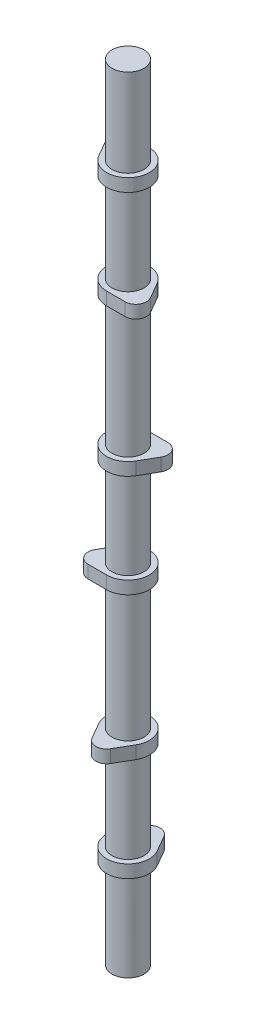
ISO-10303-21;
HEADER;
FILE_DESCRIPTION(('STEP AP214'),'2;1');
FILE_NAME('part.step','',(''),(''),'','','');
FILE_SCHEMA(('AUTOMOTIVE_DESIGN { 1 0 10303 214 1 1 1 1 }'));
ENDSEC;
DATA;
#1=APPLICATION_CONTEXT('core data for automotive mechanical design processes');
#2=APPLICATION_PROTOCOL_DEFINITION('international standard','automotive_design',2000,#1);
#3=PRODUCT_CONTEXT('',#1,'mechanical');
#4=PRODUCT('Part','Part','',(#3));
#5=PRODUCT_RELATED_PRODUCT_CATEGORY('part','',(#4));
#6=PRODUCT_DEFINITION_FORMATION('','',#4);
#7=PRODUCT_DEFINITION_CONTEXT('part definition',#1,'design');
#8=PRODUCT_DEFINITION('design','',#6,#7);
#9=PRODUCT_DEFINITION_SHAPE('','',#8);
#10=(LENGTH_UNIT() NAMED_UNIT(*) SI_UNIT(.MILLI.,.METRE.));
#11=(NAMED_UNIT(*) PLANE_ANGLE_UNIT() SI_UNIT($,.RADIAN.));
#12=(NAMED_UNIT(*) SI_UNIT($,.STERADIAN.) SOLID_ANGLE_UNIT());
#13=UNCERTAINTY_MEASURE_WITH_UNIT(LENGTH_MEASURE(1.E-05),#10,'distance_accuracy_value','');
#14=(GEOMETRIC_REPRESENTATION_CONTEXT(3) GLOBAL_UNCERTAINTY_ASSIGNED_CONTEXT((#13)) GLOBAL_UNIT_ASSIGNED_CONTEXT((#10,
#11,#12)) REPRESENTATION_CONTEXT('',''));
#15=CARTESIAN_POINT('',(0.,0.,0.));
#16=DIRECTION('',(0.,0.,1.));
#17=DIRECTION('',(1.,0.,0.));
#18=AXIS2_PLACEMENT_3D('',#15,#16,#17);
#19=CARTESIAN_POINT('',(0.,412.66,0.));
#20=DIRECTION('',(0.,-1.,0.));
#21=DIRECTION('',(0.866025403784436,0.,0.500000000000004));
#22=AXIS2_PLACEMENT_3D('',#19,#20,#21);
#23=CYLINDRICAL_SURFACE('',#22,9.5);
#24=CARTESIAN_POINT('',(0.,299.66,0.));
#25=DIRECTION('',(0.,1.,0.));
#26=DIRECTION('',(-0.866025403784436,0.,-0.500000000000004));
#27=AXIS2_PLACEMENT_3D('',#24,#25,#26);
#28=CIRCLE('',#27,9.5);
#29=CARTESIAN_POINT('',(-8.22724133595215,299.66,-4.75000000000004));
#30=VERTEX_POINT('',#29);
#31=EDGE_CURVE('E386',#30,#30,#28,.F.);
#32=ORIENTED_EDGE('',*,*,#31,.F.);
#33=EDGE_LOOP('',(#32));
#34=FACE_BOUND('',#33,.T.);
#35=CARTESIAN_POINT('',(0.,353.,0.));
#36=DIRECTION('',(0.,1.,0.));
#37=DIRECTION('',(-0.866025403784436,0.,-0.500000000000004));
#38=AXIS2_PLACEMENT_3D('',#35,#36,#37);
#39=CIRCLE('',#38,9.5);
#40=CARTESIAN_POINT('',(-8.22724133595215,353.,-4.75000000000004));
#41=VERTEX_POINT('',#40);
#42=EDGE_CURVE('E11',#41,#41,#39,.T.);
#43=ORIENTED_EDGE('',*,*,#42,.F.);
#44=EDGE_LOOP('',(#43));
#45=FACE_BOUND('',#44,.T.);
#46=ADVANCED_FACE('F35',(#34,#45),#23,.T.);
#47=CARTESIAN_POINT('',(10.9985226280623,299.66,6.35000000000005));
#48=DIRECTION('',(0.,1.,0.));
#49=DIRECTION('',(-0.866025403784436,0.,-0.500000000000004));
#50=AXIS2_PLACEMENT_3D('',#47,#48,#49);
#51=PLANE('',#50);
#52=CARTESIAN_POINT('',(10.9985226280623,299.66,6.35000000000005));
#53=DIRECTION('',(0.,1.,0.));
#54=DIRECTION('',(-0.866025403784436,0.,-0.500000000000004));
#55=AXIS2_PLACEMENT_3D('',#52,#53,#54);
#56=CIRCLE('',#55,6.35);
#57=CARTESIAN_POINT('',(10.9985226280623,299.66,12.7));
#58=VERTEX_POINT('',#57);
#59=CARTESIAN_POINT('',(16.4977839420935,299.66,3.17500000000008));
#60=VERTEX_POINT('',#59);
#61=EDGE_CURVE('E390',#58,#60,#56,.T.);
#62=ORIENTED_EDGE('',*,*,#61,.T.);
#63=DIRECTION('',(-0.499999999999996,0.,-0.866025403784441));
#64=VECTOR('',#63,1.);
#65=CARTESIAN_POINT('',(16.4977839420935,299.66,3.17500000000008));
#66=LINE('',#65,#64);
#67=CARTESIAN_POINT('',(10.9985226280624,299.66,-6.34999999999995));
#68=VERTEX_POINT('',#67);
#69=EDGE_CURVE('E85',#60,#68,#66,.T.);
#70=ORIENTED_EDGE('',*,*,#69,.T.);
#71=CARTESIAN_POINT('',(0.,299.66,0.));
#72=DIRECTION('',(0.,1.,0.));
#73=DIRECTION('',(-0.866025403784436,0.,-0.500000000000004));
#74=AXIS2_PLACEMENT_3D('',#71,#72,#73);
#75=CIRCLE('',#74,12.7);
#76=CARTESIAN_POINT('',(0.,299.66,12.7));
#77=VERTEX_POINT('',#76);
#78=EDGE_CURVE('E393',#68,#77,#75,.T.);
#79=ORIENTED_EDGE('',*,*,#78,.T.);
#80=DIRECTION('',(1.,0.,0.));
#81=VECTOR('',#80,1.);
#82=CARTESIAN_POINT('',(10.9985226280623,299.66,12.7));
#83=LINE('',#82,#81);
#84=EDGE_CURVE('E53',#77,#58,#83,.T.);
#85=ORIENTED_EDGE('',*,*,#84,.T.);
#86=EDGE_LOOP('',(#62,#70,#79,#85));
#87=FACE_BOUND('',#86,.T.);
#88=ORIENTED_EDGE('',*,*,#31,.T.);
#89=EDGE_LOOP('',(#88));
#90=FACE_BOUND('',#89,.T.);
#91=ADVANCED_FACE('F418',(#87,#90),#51,.T.);
#92=CARTESIAN_POINT('',(10.9985226280623,292.04,6.35000000000005));
#93=DIRECTION('',(0.,1.,0.));
#94=DIRECTION('',(-0.866025403784436,0.,-0.500000000000004));
#95=AXIS2_PLACEMENT_3D('',#92,#93,#94);
#96=PLANE('',#95);
#97=CARTESIAN_POINT('',(10.9985226280623,292.04,6.35000000000005));
#98=DIRECTION('',(0.,1.,0.));
#99=DIRECTION('',(-0.866025403784436,0.,-0.500000000000004));
#100=AXIS2_PLACEMENT_3D('',#97,#98,#99);
#101=CIRCLE('',#100,6.35);
#102=CARTESIAN_POINT('',(10.9985226280623,292.04,12.7));
#103=VERTEX_POINT('',#102);
#104=CARTESIAN_POINT('',(16.4977839420935,292.04,3.17500000000008));
#105=VERTEX_POINT('',#104);
#106=EDGE_CURVE('E389',#103,#105,#101,.T.);
#107=ORIENTED_EDGE('',*,*,#106,.F.);
#108=DIRECTION('',(1.,0.,0.));
#109=VECTOR('',#108,1.);
#110=CARTESIAN_POINT('',(10.9985226280623,292.04,12.7));
#111=LINE('',#110,#109);
#112=CARTESIAN_POINT('',(0.,292.04,12.7));
#113=VERTEX_POINT('',#112);
#114=EDGE_CURVE('E77',#113,#103,#111,.T.);
#115=ORIENTED_EDGE('',*,*,#114,.F.);
#116=CARTESIAN_POINT('',(0.,292.04,0.));
#117=DIRECTION('',(0.,1.,0.));
#118=DIRECTION('',(-0.866025403784436,0.,-0.500000000000004));
#119=AXIS2_PLACEMENT_3D('',#116,#117,#118);
#120=CIRCLE('',#119,12.7);
#121=CARTESIAN_POINT('',(10.9985226280624,292.04,-6.34999999999995));
#122=VERTEX_POINT('',#121);
#123=EDGE_CURVE('E71',#122,#113,#120,.T.);
#124=ORIENTED_EDGE('',*,*,#123,.F.);
#125=DIRECTION('',(-0.499999999999996,0.,-0.866025403784441));
#126=VECTOR('',#125,1.);
#127=CARTESIAN_POINT('',(16.4977839420935,292.04,3.17500000000008));
#128=LINE('',#127,#126);
#129=EDGE_CURVE('E399',#105,#122,#128,.T.);
#130=ORIENTED_EDGE('',*,*,#129,.F.);
#131=EDGE_LOOP('',(#107,#115,#124,#130));
#132=FACE_BOUND('',#131,.T.);
#133=CARTESIAN_POINT('',(0.,292.04,0.));
#134=DIRECTION('',(0.,1.,0.));
#135=DIRECTION('',(-0.866025403784436,0.,-0.500000000000004));
#136=AXIS2_PLACEMENT_3D('',#133,#134,#135);
#137=CIRCLE('',#136,9.5);
#138=CARTESIAN_POINT('',(-8.22724133595215,292.04,-4.75000000000004));
#139=VERTEX_POINT('',#138);
#140=EDGE_CURVE('E45',#139,#139,#137,.F.);
#141=ORIENTED_EDGE('',*,*,#140,.F.);
#142=EDGE_LOOP('',(#141));
#143=FACE_BOUND('',#142,.T.);
#144=ADVANCED_FACE('F416',(#132,#143),#96,.F.);
#145=CARTESIAN_POINT('',(10.9985226280623,299.66,6.35000000000005));
#146=DIRECTION('',(0.,-1.,0.));
#147=DIRECTION('',(0.866025403784436,0.,0.500000000000004));
#148=AXIS2_PLACEMENT_3D('',#145,#146,#147);
#149=CYLINDRICAL_SURFACE('',#148,6.35);
#150=ORIENTED_EDGE('',*,*,#106,.T.);
#151=DIRECTION('',(0.,-1.,0.));
#152=VECTOR('',#151,1.);
#153=CARTESIAN_POINT('',(16.4977839420935,299.66,3.17500000000008));
#154=LINE('',#153,#152);
#155=EDGE_CURVE('E408',#60,#105,#154,.T.);
#156=ORIENTED_EDGE('',*,*,#155,.F.);
#157=ORIENTED_EDGE('',*,*,#61,.F.);
#158=DIRECTION('',(0.,-1.,0.));
#159=VECTOR('',#158,1.);
#160=CARTESIAN_POINT('',(10.9985226280623,299.66,12.7));
#161=LINE('',#160,#159);
#162=EDGE_CURVE('E396',#58,#103,#161,.T.);
#163=ORIENTED_EDGE('',*,*,#162,.T.);
#164=EDGE_LOOP('',(#150,#156,#157,#163));
#165=FACE_BOUND('',#164,.T.);
#166=ADVANCED_FACE('F37',(#165),#149,.T.);
#167=CARTESIAN_POINT('',(16.4977839420935,299.66,3.17500000000008));
#168=DIRECTION('',(-0.866025403784441,0.,0.499999999999996));
#169=DIRECTION('',(0.499999999999996,0.,0.866025403784441));
#170=AXIS2_PLACEMENT_3D('',#167,#168,#169);
#171=PLANE('',#170);
#172=ORIENTED_EDGE('',*,*,#129,.T.);
#173=DIRECTION('',(0.,-1.,0.));
#174=VECTOR('',#173,1.);
#175=CARTESIAN_POINT('',(10.9985226280624,299.66,-6.34999999999995));
#176=LINE('',#175,#174);
#177=EDGE_CURVE('E406',#68,#122,#176,.T.);
#178=ORIENTED_EDGE('',*,*,#177,.F.);
#179=ORIENTED_EDGE('',*,*,#69,.F.);
#180=ORIENTED_EDGE('',*,*,#155,.T.);
#181=EDGE_LOOP('',(#172,#178,#179,#180));
#182=FACE_BOUND('',#181,.T.);
#183=ADVANCED_FACE('F425',(#182),#171,.F.);
#184=CARTESIAN_POINT('',(0.,299.66,0.));
#185=DIRECTION('',(0.,-1.,0.));
#186=DIRECTION('',(0.866025403784436,0.,0.500000000000004));
#187=AXIS2_PLACEMENT_3D('',#184,#185,#186);
#188=CYLINDRICAL_SURFACE('',#187,12.7);
#189=ORIENTED_EDGE('',*,*,#123,.T.);
#190=DIRECTION('',(0.,-1.,0.));
#191=VECTOR('',#190,1.);
#192=CARTESIAN_POINT('',(0.,299.66,12.7));
#193=LINE('',#192,#191);
#194=EDGE_CURVE('E404',#77,#113,#193,.T.);
#195=ORIENTED_EDGE('',*,*,#194,.F.);
#196=ORIENTED_EDGE('',*,*,#78,.F.);
#197=ORIENTED_EDGE('',*,*,#177,.T.);
#198=EDGE_LOOP('',(#189,#195,#196,#197));
#199=FACE_BOUND('',#198,.T.);
#200=ADVANCED_FACE('F549',(#199),#188,.T.);
#201=CARTESIAN_POINT('',(10.9985226280623,299.66,12.7));
#202=DIRECTION('',(0.,0.,-1.));
#203=DIRECTION('',(-1.,0.,0.));
#204=AXIS2_PLACEMENT_3D('',#201,#202,#203);
#205=PLANE('',#204);
#206=ORIENTED_EDGE('',*,*,#114,.T.);
#207=ORIENTED_EDGE('',*,*,#162,.F.);
#208=ORIENTED_EDGE('',*,*,#84,.F.);
#209=ORIENTED_EDGE('',*,*,#194,.T.);
#210=EDGE_LOOP('',(#206,#207,#208,#209));
#211=FACE_BOUND('',#210,.T.);
#212=ADVANCED_FACE('F441',(#211),#205,.F.);
#213=ORIENTED_EDGE('',*,*,#140,.T.);
#214=EDGE_LOOP('',(#213));
#215=FACE_BOUND('',#214,.T.);
#216=CARTESIAN_POINT('',(0.,214.6,0.));
#217=DIRECTION('',(0.,1.,0.));
#218=DIRECTION('',(0.866025403784436,0.,-0.500000000000004));
#219=AXIS2_PLACEMENT_3D('',#216,#217,#218);
#220=CIRCLE('',#219,9.5);
#221=CARTESIAN_POINT('',(8.22724133595215,214.6,-4.75000000000004));
#222=VERTEX_POINT('',#221);
#223=EDGE_CURVE('E311',#222,#222,#220,.T.);
#224=ORIENTED_EDGE('',*,*,#223,.T.);
#225=EDGE_LOOP('',(#224));
#226=FACE_BOUND('',#225,.T.);
#227=ADVANCED_FACE('F413',(#215,#226),#23,.T.);
#228=CARTESIAN_POINT('',(-10.9985226280623,360.62,-6.35000000000013));
#229=DIRECTION('',(0.,1.,0.));
#230=DIRECTION('',(0.866025403784433,0.,0.50000000000001));
#231=AXIS2_PLACEMENT_3D('',#228,#229,#230);
#232=PLANE('',#231);
#233=CARTESIAN_POINT('',(-10.9985226280623,360.62,-6.35000000000013));
#234=DIRECTION('',(0.,1.,0.));
#235=DIRECTION('',(0.866025403784433,0.,0.50000000000001));
#236=AXIS2_PLACEMENT_3D('',#233,#234,#235);
#237=CIRCLE('',#236,6.35);
#238=CARTESIAN_POINT('',(-10.9985226280622,360.62,-12.7000000000001));
#239=VERTEX_POINT('',#238);
#240=CARTESIAN_POINT('',(-16.4977839420935,360.62,-3.17500000000019));
#241=VERTEX_POINT('',#240);
#242=EDGE_CURVE('E354',#239,#241,#237,.T.);
#243=ORIENTED_EDGE('',*,*,#242,.T.);
#244=DIRECTION('',(0.49999999999999,0.,0.866025403784445));
#245=VECTOR('',#244,1.);
#246=CARTESIAN_POINT('',(-16.4977839420935,360.62,-3.17500000000019));
#247=LINE('',#246,#245);
#248=CARTESIAN_POINT('',(-10.9985226280624,360.62,6.34999999999987));
#249=VERTEX_POINT('',#248);
#250=EDGE_CURVE('E357',#241,#249,#247,.T.);
#251=ORIENTED_EDGE('',*,*,#250,.T.);
#252=CARTESIAN_POINT('',(0.,360.62,0.));
#253=DIRECTION('',(0.,1.,0.));
#254=DIRECTION('',(0.866025403784433,0.,0.50000000000001));
#255=AXIS2_PLACEMENT_3D('',#252,#253,#254);
#256=CIRCLE('',#255,12.7);
#257=CARTESIAN_POINT('',(1.32706345912226E-13,360.62,-12.7));
#258=VERTEX_POINT('',#257);
#259=EDGE_CURVE('E360',#249,#258,#256,.T.);
#260=ORIENTED_EDGE('',*,*,#259,.T.);
#261=DIRECTION('',(-1.,0.,0.));
#262=VECTOR('',#261,1.);
#263=CARTESIAN_POINT('',(-10.9985226280622,360.62,-12.7000000000001));
#264=LINE('',#263,#262);
#265=EDGE_CURVE('E362',#258,#239,#264,.T.);
#266=ORIENTED_EDGE('',*,*,#265,.T.);
#267=EDGE_LOOP('',(#243,#251,#260,#266));
#268=FACE_BOUND('',#267,.T.);
#269=CARTESIAN_POINT('',(0.,360.62,0.));
#270=DIRECTION('',(0.,1.,0.));
#271=DIRECTION('',(-0.866025403784436,0.,-0.500000000000004));
#272=AXIS2_PLACEMENT_3D('',#269,#270,#271);
#273=CIRCLE('',#272,9.5);
#274=CARTESIAN_POINT('',(-8.22724133595215,360.62,-4.75000000000004));
#275=VERTEX_POINT('',#274);
#276=EDGE_CURVE('E39',#275,#275,#273,.T.);
#277=ORIENTED_EDGE('',*,*,#276,.F.);
#278=EDGE_LOOP('',(#277));
#279=FACE_BOUND('',#278,.T.);
#280=ADVANCED_FACE('F440',(#268,#279),#232,.T.);
#281=CARTESIAN_POINT('',(-10.9985226280623,353.,-6.35000000000013));
#282=DIRECTION('',(0.,1.,0.));
#283=DIRECTION('',(0.866025403784433,0.,0.50000000000001));
#284=AXIS2_PLACEMENT_3D('',#281,#282,#283);
#285=PLANE('',#284);
#286=CARTESIAN_POINT('',(-10.9985226280623,353.,-6.35000000000013));
#287=DIRECTION('',(0.,1.,0.));
#288=DIRECTION('',(0.866025403784433,0.,0.50000000000001));
#289=AXIS2_PLACEMENT_3D('',#286,#287,#288);
#290=CIRCLE('',#289,6.35);
#291=CARTESIAN_POINT('',(-10.9985226280622,353.,-12.7000000000001));
#292=VERTEX_POINT('',#291);
#293=CARTESIAN_POINT('',(-16.4977839420935,353.,-3.17500000000019));
#294=VERTEX_POINT('',#293);
#295=EDGE_CURVE('E351',#292,#294,#290,.T.);
#296=ORIENTED_EDGE('',*,*,#295,.F.);
#297=DIRECTION('',(-1.,0.,0.));
#298=VECTOR('',#297,1.);
#299=CARTESIAN_POINT('',(-10.9985226280622,353.,-12.7000000000001));
#300=LINE('',#299,#298);
#301=CARTESIAN_POINT('',(1.32706345912226E-13,353.,-12.7));
#302=VERTEX_POINT('',#301);
#303=EDGE_CURVE('E358',#302,#292,#300,.T.);
#304=ORIENTED_EDGE('',*,*,#303,.F.);
#305=CARTESIAN_POINT('',(0.,353.,0.));
#306=DIRECTION('',(0.,1.,0.));
#307=DIRECTION('',(0.866025403784433,0.,0.50000000000001));
#308=AXIS2_PLACEMENT_3D('',#305,#306,#307);
#309=CIRCLE('',#308,12.7);
#310=CARTESIAN_POINT('',(-10.9985226280624,353.,6.34999999999987));
#311=VERTEX_POINT('',#310);
#312=EDGE_CURVE('E369',#311,#302,#309,.T.);
#313=ORIENTED_EDGE('',*,*,#312,.F.);
#314=DIRECTION('',(0.49999999999999,0.,0.866025403784445));
#315=VECTOR('',#314,1.);
#316=CARTESIAN_POINT('',(-16.4977839420935,353.,-3.17500000000019));
#317=LINE('',#316,#315);
#318=EDGE_CURVE('E367',#294,#311,#317,.T.);
#319=ORIENTED_EDGE('',*,*,#318,.F.);
#320=EDGE_LOOP('',(#296,#304,#313,#319));
#321=FACE_BOUND('',#320,.T.);
#322=ORIENTED_EDGE('',*,*,#42,.T.);
#323=EDGE_LOOP('',(#322));
#324=FACE_BOUND('',#323,.T.);
#325=ADVANCED_FACE('F462',(#321,#324),#285,.F.);
#326=CARTESIAN_POINT('',(-10.9985226280623,360.62,-6.35000000000013));
#327=DIRECTION('',(0.,-1.,0.));
#328=DIRECTION('',(-0.866025403784433,0.,-0.50000000000001));
#329=AXIS2_PLACEMENT_3D('',#326,#327,#328);
#330=CYLINDRICAL_SURFACE('',#329,6.35);
#331=ORIENTED_EDGE('',*,*,#295,.T.);
#332=DIRECTION('',(0.,-1.,0.));
#333=VECTOR('',#332,1.);
#334=CARTESIAN_POINT('',(-16.4977839420935,360.62,-3.17500000000019));
#335=LINE('',#334,#333);
#336=EDGE_CURVE('E380',#241,#294,#335,.T.);
#337=ORIENTED_EDGE('',*,*,#336,.F.);
#338=ORIENTED_EDGE('',*,*,#242,.F.);
#339=DIRECTION('',(0.,-1.,0.));
#340=VECTOR('',#339,1.);
#341=CARTESIAN_POINT('',(-10.9985226280622,360.62,-12.7000000000001));
#342=LINE('',#341,#340);
#343=EDGE_CURVE('E364',#239,#292,#342,.T.);
#344=ORIENTED_EDGE('',*,*,#343,.T.);
#345=EDGE_LOOP('',(#331,#337,#338,#344));
#346=FACE_BOUND('',#345,.T.);
#347=ADVANCED_FACE('F468',(#346),#330,.T.);
#348=CARTESIAN_POINT('',(-16.4977839420935,360.62,-3.17500000000019));
#349=DIRECTION('',(0.866025403784445,0.,-0.49999999999999));
#350=DIRECTION('',(-0.49999999999999,0.,-0.866025403784445));
#351=AXIS2_PLACEMENT_3D('',#348,#349,#350);
#352=PLANE('',#351);
#353=ORIENTED_EDGE('',*,*,#318,.T.);
#354=DIRECTION('',(0.,-1.,0.));
#355=VECTOR('',#354,1.);
#356=CARTESIAN_POINT('',(-10.9985226280624,360.62,6.34999999999987));
#357=LINE('',#356,#355);
#358=EDGE_CURVE('E377',#249,#311,#357,.T.);
#359=ORIENTED_EDGE('',*,*,#358,.F.);
#360=ORIENTED_EDGE('',*,*,#250,.F.);
#361=ORIENTED_EDGE('',*,*,#336,.T.);
#362=EDGE_LOOP('',(#353,#359,#360,#361));
#363=FACE_BOUND('',#362,.T.);
#364=ADVANCED_FACE('F481',(#363),#352,.F.);
#365=CARTESIAN_POINT('',(0.,360.62,0.));
#366=DIRECTION('',(0.,-1.,0.));
#367=DIRECTION('',(-0.866025403784433,0.,-0.50000000000001));
#368=AXIS2_PLACEMENT_3D('',#365,#366,#367);
#369=CYLINDRICAL_SURFACE('',#368,12.7);
#370=ORIENTED_EDGE('',*,*,#312,.T.);
#371=DIRECTION('',(0.,-1.,0.));
#372=VECTOR('',#371,1.);
#373=CARTESIAN_POINT('',(1.32706345912226E-13,360.62,-12.7));
#374=LINE('',#373,#372);
#375=EDGE_CURVE('E374',#258,#302,#374,.T.);
#376=ORIENTED_EDGE('',*,*,#375,.F.);
#377=ORIENTED_EDGE('',*,*,#259,.F.);
#378=ORIENTED_EDGE('',*,*,#358,.T.);
#379=EDGE_LOOP('',(#370,#376,#377,#378));
#380=FACE_BOUND('',#379,.T.);
#381=ADVANCED_FACE('F477',(#380),#369,.T.);
#382=CARTESIAN_POINT('',(-10.9985226280622,360.62,-12.7000000000001));
#383=DIRECTION('',(0.,0.,1.));
#384=DIRECTION('',(1.,0.,0.));
#385=AXIS2_PLACEMENT_3D('',#382,#383,#384);
#386=PLANE('',#385);
#387=ORIENTED_EDGE('',*,*,#303,.T.);
#388=ORIENTED_EDGE('',*,*,#343,.F.);
#389=ORIENTED_EDGE('',*,*,#265,.F.);
#390=ORIENTED_EDGE('',*,*,#375,.T.);
#391=EDGE_LOOP('',(#387,#388,#389,#390));
#392=FACE_BOUND('',#391,.T.);
#393=ADVANCED_FACE('F454',(#392),#386,.F.);
#394=CARTESIAN_POINT('',(0.,412.66,0.));
#395=DIRECTION('',(0.,1.,0.));
#396=DIRECTION('',(-0.866025403784436,0.,-0.500000000000004));
#397=AXIS2_PLACEMENT_3D('',#394,#395,#396);
#398=PLANE('',#397);
#399=CARTESIAN_POINT('',(0.,412.66,0.));
#400=DIRECTION('',(0.,1.,0.));
#401=DIRECTION('',(-0.866025403784436,0.,-0.500000000000004));
#402=AXIS2_PLACEMENT_3D('',#399,#400,#401);
#403=CIRCLE('',#402,9.5);
#404=CARTESIAN_POINT('',(-8.22724133595215,412.66,-4.75000000000004));
#405=VERTEX_POINT('',#404);
#406=EDGE_CURVE('E383',#405,#405,#403,.T.);
#407=ORIENTED_EDGE('',*,*,#406,.T.);
#408=EDGE_LOOP('',(#407));
#409=FACE_BOUND('',#408,.T.);
#410=ADVANCED_FACE('F444',(#409),#398,.T.);
#411=ORIENTED_EDGE('',*,*,#276,.T.);
#412=EDGE_LOOP('',(#411));
#413=FACE_BOUND('',#412,.T.);
#414=ORIENTED_EDGE('',*,*,#406,.F.);
#415=EDGE_LOOP('',(#414));
#416=FACE_BOUND('',#415,.T.);
#417=ADVANCED_FACE('F433',(#413,#416),#23,.T.);
#418=CARTESIAN_POINT('',(0.,266.64,0.));
#419=DIRECTION('',(0.,-1.,0.));
#420=DIRECTION('',(-0.866025403784436,0.,0.500000000000004));
#421=AXIS2_PLACEMENT_3D('',#418,#419,#420);
#422=CYLINDRICAL_SURFACE('',#421,9.5);
#423=CARTESIAN_POINT('',(0.,153.64,0.));
#424=DIRECTION('',(0.,1.,0.));
#425=DIRECTION('',(0.866025403784436,0.,-0.500000000000004));
#426=AXIS2_PLACEMENT_3D('',#423,#424,#425);
#427=CIRCLE('',#426,9.5);
#428=CARTESIAN_POINT('',(8.22724133595215,153.64,-4.75000000000004));
#429=VERTEX_POINT('',#428);
#430=EDGE_CURVE('E312',#429,#429,#427,.F.);
#431=ORIENTED_EDGE('',*,*,#430,.F.);
#432=EDGE_LOOP('',(#431));
#433=FACE_BOUND('',#432,.T.);
#434=CARTESIAN_POINT('',(0.,206.98,0.));
#435=DIRECTION('',(0.,1.,0.));
#436=DIRECTION('',(0.866025403784436,0.,-0.500000000000004));
#437=AXIS2_PLACEMENT_3D('',#434,#435,#436);
#438=CIRCLE('',#437,9.5);
#439=CARTESIAN_POINT('',(8.22724133595215,206.98,-4.75000000000004));
#440=VERTEX_POINT('',#439);
#441=EDGE_CURVE('E348',#440,#440,#438,.T.);
#442=ORIENTED_EDGE('',*,*,#441,.F.);
#443=EDGE_LOOP('',(#442));
#444=FACE_BOUND('',#443,.T.);
#445=ADVANCED_FACE('F443',(#433,#444),#422,.T.);
#446=CARTESIAN_POINT('',(-10.9985226280623,153.64,6.35000000000005));
#447=DIRECTION('',(0.,1.,0.));
#448=DIRECTION('',(0.866025403784436,0.,-0.500000000000004));
#449=AXIS2_PLACEMENT_3D('',#446,#447,#448);
#450=PLANE('',#449);
#451=CARTESIAN_POINT('',(-10.9985226280623,153.64,6.35000000000005));
#452=DIRECTION('',(0.,1.,0.));
#453=DIRECTION('',(0.866025403784436,0.,-0.500000000000004));
#454=AXIS2_PLACEMENT_3D('',#451,#452,#453);
#455=CIRCLE('',#454,6.35);
#456=CARTESIAN_POINT('',(-16.4977839420935,153.64,3.17500000000008));
#457=VERTEX_POINT('',#456);
#458=CARTESIAN_POINT('',(-10.9985226280623,153.64,12.7000000000001));
#459=VERTEX_POINT('',#458);
#460=EDGE_CURVE('E316',#457,#459,#455,.T.);
#461=ORIENTED_EDGE('',*,*,#460,.T.);
#462=DIRECTION('',(1.,0.,0.));
#463=VECTOR('',#462,1.);
#464=CARTESIAN_POINT('',(-10.9985226280623,153.64,12.7000000000001));
#465=LINE('',#464,#463);
#466=CARTESIAN_POINT('',(0.,153.64,12.7));
#467=VERTEX_POINT('',#466);
#468=EDGE_CURVE('E319',#459,#467,#465,.T.);
#469=ORIENTED_EDGE('',*,*,#468,.T.);
#470=CARTESIAN_POINT('',(0.,153.64,0.));
#471=DIRECTION('',(0.,1.,0.));
#472=DIRECTION('',(0.866025403784436,0.,-0.500000000000004));
#473=AXIS2_PLACEMENT_3D('',#470,#471,#472);
#474=CIRCLE('',#473,12.7);
#475=CARTESIAN_POINT('',(-10.9985226280624,153.64,-6.34999999999994));
#476=VERTEX_POINT('',#475);
#477=EDGE_CURVE('E322',#467,#476,#474,.T.);
#478=ORIENTED_EDGE('',*,*,#477,.T.);
#479=DIRECTION('',(-0.499999999999996,0.,0.866025403784441));
#480=VECTOR('',#479,1.);
#481=CARTESIAN_POINT('',(-16.4977839420935,153.64,3.17500000000008));
#482=LINE('',#481,#480);
#483=EDGE_CURVE('E324',#476,#457,#482,.T.);
#484=ORIENTED_EDGE('',*,*,#483,.T.);
#485=EDGE_LOOP('',(#461,#469,#478,#484));
#486=FACE_BOUND('',#485,.T.);
#487=ORIENTED_EDGE('',*,*,#430,.T.);
#488=EDGE_LOOP('',(#487));
#489=FACE_BOUND('',#488,.T.);
#490=ADVANCED_FACE('F450',(#486,#489),#450,.T.);
#491=CARTESIAN_POINT('',(-10.9985226280623,146.02,6.35000000000005));
#492=DIRECTION('',(0.,1.,0.));
#493=DIRECTION('',(0.866025403784436,0.,-0.500000000000004));
#494=AXIS2_PLACEMENT_3D('',#491,#492,#493);
#495=PLANE('',#494);
#496=CARTESIAN_POINT('',(-10.9985226280623,146.02,6.35000000000005));
#497=DIRECTION('',(0.,1.,0.));
#498=DIRECTION('',(0.866025403784436,0.,-0.500000000000004));
#499=AXIS2_PLACEMENT_3D('',#496,#497,#498);
#500=CIRCLE('',#499,6.35);
#501=CARTESIAN_POINT('',(-16.4977839420935,146.02,3.17500000000008));
#502=VERTEX_POINT('',#501);
#503=CARTESIAN_POINT('',(-10.9985226280623,146.02,12.7000000000001));
#504=VERTEX_POINT('',#503);
#505=EDGE_CURVE('E315',#502,#504,#500,.T.);
#506=ORIENTED_EDGE('',*,*,#505,.F.);
#507=DIRECTION('',(-0.499999999999996,0.,0.866025403784441));
#508=VECTOR('',#507,1.);
#509=CARTESIAN_POINT('',(-16.4977839420935,146.02,3.17500000000008));
#510=LINE('',#509,#508);
#511=CARTESIAN_POINT('',(-10.9985226280624,146.02,-6.34999999999994));
#512=VERTEX_POINT('',#511);
#513=EDGE_CURVE('E320',#512,#502,#510,.T.);
#514=ORIENTED_EDGE('',*,*,#513,.F.);
#515=CARTESIAN_POINT('',(0.,146.02,0.));
#516=DIRECTION('',(0.,1.,0.));
#517=DIRECTION('',(0.866025403784436,0.,-0.500000000000004));
#518=AXIS2_PLACEMENT_3D('',#515,#516,#517);
#519=CIRCLE('',#518,12.7);
#520=CARTESIAN_POINT('',(0.,146.02,12.7));
#521=VERTEX_POINT('',#520);
#522=EDGE_CURVE('E331',#521,#512,#519,.T.);
#523=ORIENTED_EDGE('',*,*,#522,.F.);
#524=DIRECTION('',(1.,0.,0.));
#525=VECTOR('',#524,1.);
#526=CARTESIAN_POINT('',(-10.9985226280623,146.02,12.7000000000001));
#527=LINE('',#526,#525);
#528=EDGE_CURVE('E329',#504,#521,#527,.T.);
#529=ORIENTED_EDGE('',*,*,#528,.F.);
#530=EDGE_LOOP('',(#506,#514,#523,#529));
#531=FACE_BOUND('',#530,.T.);
#532=CARTESIAN_POINT('',(0.,146.02,0.));
#533=DIRECTION('',(0.,1.,0.));
#534=DIRECTION('',(0.866025403784436,0.,-0.500000000000004));
#535=AXIS2_PLACEMENT_3D('',#532,#533,#534);
#536=CIRCLE('',#535,9.5);
#537=CARTESIAN_POINT('',(8.22724133595215,146.02,-4.75000000000004));
#538=VERTEX_POINT('',#537);
#539=EDGE_CURVE('E345',#538,#538,#536,.F.);
#540=ORIENTED_EDGE('',*,*,#539,.F.);
#541=EDGE_LOOP('',(#540));
#542=FACE_BOUND('',#541,.T.);
#543=ADVANCED_FACE('F583',(#531,#542),#495,.F.);
#544=CARTESIAN_POINT('',(-10.9985226280623,153.64,6.35000000000005));
#545=DIRECTION('',(0.,-1.,0.));
#546=DIRECTION('',(-0.866025403784436,0.,0.500000000000004));
#547=AXIS2_PLACEMENT_3D('',#544,#545,#546);
#548=CYLINDRICAL_SURFACE('',#547,6.35);
#549=ORIENTED_EDGE('',*,*,#505,.T.);
#550=DIRECTION('',(0.,-1.,0.));
#551=VECTOR('',#550,1.);
#552=CARTESIAN_POINT('',(-10.9985226280623,153.64,12.7000000000001));
#553=LINE('',#552,#551);
#554=EDGE_CURVE('E342',#459,#504,#553,.T.);
#555=ORIENTED_EDGE('',*,*,#554,.F.);
#556=ORIENTED_EDGE('',*,*,#460,.F.);
#557=DIRECTION('',(0.,-1.,0.));
#558=VECTOR('',#557,1.);
#559=CARTESIAN_POINT('',(-16.4977839420935,153.64,3.17500000000008));
#560=LINE('',#559,#558);
#561=EDGE_CURVE('E326',#457,#502,#560,.T.);
#562=ORIENTED_EDGE('',*,*,#561,.T.);
#563=EDGE_LOOP('',(#549,#555,#556,#562));
#564=FACE_BOUND('',#563,.T.);
#565=ADVANCED_FACE('F472',(#564),#548,.T.);
#566=CARTESIAN_POINT('',(-10.9985226280623,153.64,12.7000000000001));
#567=DIRECTION('',(0.,0.,-1.));
#568=DIRECTION('',(-1.,0.,0.));
#569=AXIS2_PLACEMENT_3D('',#566,#567,#568);
#570=PLANE('',#569);
#571=ORIENTED_EDGE('',*,*,#528,.T.);
#572=DIRECTION('',(0.,-1.,0.));
#573=VECTOR('',#572,1.);
#574=CARTESIAN_POINT('',(0.,153.64,12.7));
#575=LINE('',#574,#573);
#576=EDGE_CURVE('E339',#467,#521,#575,.T.);
#577=ORIENTED_EDGE('',*,*,#576,.F.);
#578=ORIENTED_EDGE('',*,*,#468,.F.);
#579=ORIENTED_EDGE('',*,*,#554,.T.);
#580=EDGE_LOOP('',(#571,#577,#578,#579));
#581=FACE_BOUND('',#580,.T.);
#582=ADVANCED_FACE('F602',(#581),#570,.F.);
#583=CARTESIAN_POINT('',(0.,153.64,0.));
#584=DIRECTION('',(0.,-1.,0.));
#585=DIRECTION('',(-0.866025403784436,0.,0.500000000000004));
#586=AXIS2_PLACEMENT_3D('',#583,#584,#585);
#587=CYLINDRICAL_SURFACE('',#586,12.7);
#588=ORIENTED_EDGE('',*,*,#522,.T.);
#589=DIRECTION('',(0.,-1.,0.));
#590=VECTOR('',#589,1.);
#591=CARTESIAN_POINT('',(-10.9985226280624,153.64,-6.34999999999994));
#592=LINE('',#591,#590);
#593=EDGE_CURVE('E336',#476,#512,#592,.T.);
#594=ORIENTED_EDGE('',*,*,#593,.F.);
#595=ORIENTED_EDGE('',*,*,#477,.F.);
#596=ORIENTED_EDGE('',*,*,#576,.T.);
#597=EDGE_LOOP('',(#588,#594,#595,#596));
#598=FACE_BOUND('',#597,.T.);
#599=ADVANCED_FACE('F611',(#598),#587,.T.);
#600=CARTESIAN_POINT('',(-16.4977839420935,153.64,3.17500000000008));
#601=DIRECTION('',(0.866025403784441,0.,0.499999999999996));
#602=DIRECTION('',(0.499999999999996,0.,-0.866025403784441));
#603=AXIS2_PLACEMENT_3D('',#600,#601,#602);
#604=PLANE('',#603);
#605=ORIENTED_EDGE('',*,*,#513,.T.);
#606=ORIENTED_EDGE('',*,*,#561,.F.);
#607=ORIENTED_EDGE('',*,*,#483,.F.);
#608=ORIENTED_EDGE('',*,*,#593,.T.);
#609=EDGE_LOOP('',(#605,#606,#607,#608));
#610=FACE_BOUND('',#609,.T.);
#611=ADVANCED_FACE('F620',(#610),#604,.F.);
#612=ORIENTED_EDGE('',*,*,#539,.T.);
#613=EDGE_LOOP('',(#612));
#614=FACE_BOUND('',#613,.T.);
#615=CARTESIAN_POINT('',(0.,68.58,0.));
#616=DIRECTION('',(0.,1.,0.));
#617=DIRECTION('',(0.,0.,1.));
#618=AXIS2_PLACEMENT_3D('',#615,#616,#617);
#619=CIRCLE('',#618,9.5);
#620=CARTESIAN_POINT('',(0.,68.58,9.5));
#621=VERTEX_POINT('',#620);
#622=EDGE_CURVE('E234',#621,#621,#619,.T.);
#623=ORIENTED_EDGE('',*,*,#622,.T.);
#624=EDGE_LOOP('',(#623));
#625=FACE_BOUND('',#624,.T.);
#626=ADVANCED_FACE('F453',(#614,#625),#422,.T.);
#627=CARTESIAN_POINT('',(10.9985226280624,214.6,-6.34999999999997));
#628=DIRECTION('',(0.,1.,0.));
#629=DIRECTION('',(-0.86602540378444,0.,0.499999999999998));
#630=AXIS2_PLACEMENT_3D('',#627,#628,#629);
#631=PLANE('',#630);
#632=CARTESIAN_POINT('',(10.9985226280624,214.6,-6.34999999999997));
#633=DIRECTION('',(0.,1.,0.));
#634=DIRECTION('',(-0.86602540378444,0.,0.499999999999998));
#635=AXIS2_PLACEMENT_3D('',#632,#633,#634);
#636=CIRCLE('',#635,6.35);
#637=CARTESIAN_POINT('',(16.4977839420936,214.6,-3.17499999999996));
#638=VERTEX_POINT('',#637);
#639=CARTESIAN_POINT('',(10.9985226280624,214.6,-12.7));
#640=VERTEX_POINT('',#639);
#641=EDGE_CURVE('E282',#638,#640,#636,.T.);
#642=ORIENTED_EDGE('',*,*,#641,.T.);
#643=DIRECTION('',(-1.,0.,0.));
#644=VECTOR('',#643,1.);
#645=CARTESIAN_POINT('',(10.9985226280624,214.6,-12.7));
#646=LINE('',#645,#644);
#647=CARTESIAN_POINT('',(0.,214.6,-12.7));
#648=VERTEX_POINT('',#647);
#649=EDGE_CURVE('E285',#640,#648,#646,.T.);
#650=ORIENTED_EDGE('',*,*,#649,.T.);
#651=CARTESIAN_POINT('',(0.,214.6,0.));
#652=DIRECTION('',(0.,1.,0.));
#653=DIRECTION('',(-0.86602540378444,0.,0.499999999999998));
#654=AXIS2_PLACEMENT_3D('',#651,#652,#653);
#655=CIRCLE('',#654,12.7);
#656=CARTESIAN_POINT('',(10.9985226280624,214.6,6.35000000000001));
#657=VERTEX_POINT('',#656);
#658=EDGE_CURVE('E288',#648,#657,#655,.T.);
#659=ORIENTED_EDGE('',*,*,#658,.T.);
#660=DIRECTION('',(0.500000000000002,0.,-0.866025403784438));
#661=VECTOR('',#660,1.);
#662=CARTESIAN_POINT('',(16.4977839420936,214.6,-3.17499999999996));
#663=LINE('',#662,#661);
#664=EDGE_CURVE('E290',#657,#638,#663,.T.);
#665=ORIENTED_EDGE('',*,*,#664,.T.);
#666=EDGE_LOOP('',(#642,#650,#659,#665));
#667=FACE_BOUND('',#666,.T.);
#668=ORIENTED_EDGE('',*,*,#223,.F.);
#669=EDGE_LOOP('',(#668));
#670=FACE_BOUND('',#669,.T.);
#671=ADVANCED_FACE('F639',(#667,#670),#631,.T.);
#672=CARTESIAN_POINT('',(10.9985226280624,206.98,-6.34999999999997));
#673=DIRECTION('',(0.,1.,0.));
#674=DIRECTION('',(-0.86602540378444,0.,0.499999999999998));
#675=AXIS2_PLACEMENT_3D('',#672,#673,#674);
#676=PLANE('',#675);
#677=CARTESIAN_POINT('',(10.9985226280624,206.98,-6.34999999999997));
#678=DIRECTION('',(0.,1.,0.));
#679=DIRECTION('',(-0.86602540378444,0.,0.499999999999998));
#680=AXIS2_PLACEMENT_3D('',#677,#678,#679);
#681=CIRCLE('',#680,6.35);
#682=CARTESIAN_POINT('',(16.4977839420936,206.98,-3.17499999999996));
#683=VERTEX_POINT('',#682);
#684=CARTESIAN_POINT('',(10.9985226280624,206.98,-12.7));
#685=VERTEX_POINT('',#684);
#686=EDGE_CURVE('E280',#683,#685,#681,.T.);
#687=ORIENTED_EDGE('',*,*,#686,.F.);
#688=DIRECTION('',(0.500000000000002,0.,-0.866025403784438));
#689=VECTOR('',#688,1.);
#690=CARTESIAN_POINT('',(16.4977839420936,206.98,-3.17499999999996));
#691=LINE('',#690,#689);
#692=CARTESIAN_POINT('',(10.9985226280624,206.98,6.35000000000001));
#693=VERTEX_POINT('',#692);
#694=EDGE_CURVE('E286',#693,#683,#691,.T.);
#695=ORIENTED_EDGE('',*,*,#694,.F.);
#696=CARTESIAN_POINT('',(0.,206.98,0.));
#697=DIRECTION('',(0.,1.,0.));
#698=DIRECTION('',(-0.86602540378444,0.,0.499999999999998));
#699=AXIS2_PLACEMENT_3D('',#696,#697,#698);
#700=CIRCLE('',#699,12.7);
#701=CARTESIAN_POINT('',(0.,206.98,-12.7));
#702=VERTEX_POINT('',#701);
#703=EDGE_CURVE('E297',#702,#693,#700,.T.);
#704=ORIENTED_EDGE('',*,*,#703,.F.);
#705=DIRECTION('',(-1.,0.,0.));
#706=VECTOR('',#705,1.);
#707=CARTESIAN_POINT('',(10.9985226280624,206.98,-12.7));
#708=LINE('',#707,#706);
#709=EDGE_CURVE('E295',#685,#702,#708,.T.);
#710=ORIENTED_EDGE('',*,*,#709,.F.);
#711=EDGE_LOOP('',(#687,#695,#704,#710));
#712=FACE_BOUND('',#711,.T.);
#713=ORIENTED_EDGE('',*,*,#441,.T.);
#714=EDGE_LOOP('',(#713));
#715=FACE_BOUND('',#714,.T.);
#716=ADVANCED_FACE('F649',(#712,#715),#676,.F.);
#717=CARTESIAN_POINT('',(10.9985226280624,214.6,-6.34999999999997));
#718=DIRECTION('',(0.,-1.,0.));
#719=DIRECTION('',(0.86602540378444,0.,-0.499999999999998));
#720=AXIS2_PLACEMENT_3D('',#717,#718,#719);
#721=CYLINDRICAL_SURFACE('',#720,6.35);
#722=ORIENTED_EDGE('',*,*,#686,.T.);
#723=DIRECTION('',(0.,-1.,0.));
#724=VECTOR('',#723,1.);
#725=CARTESIAN_POINT('',(10.9985226280624,214.6,-12.7));
#726=LINE('',#725,#724);
#727=EDGE_CURVE('E308',#640,#685,#726,.T.);
#728=ORIENTED_EDGE('',*,*,#727,.F.);
#729=ORIENTED_EDGE('',*,*,#641,.F.);
#730=DIRECTION('',(0.,-1.,0.));
#731=VECTOR('',#730,1.);
#732=CARTESIAN_POINT('',(16.4977839420936,214.6,-3.17499999999996));
#733=LINE('',#732,#731);
#734=EDGE_CURVE('E292',#638,#683,#733,.T.);
#735=ORIENTED_EDGE('',*,*,#734,.T.);
#736=EDGE_LOOP('',(#722,#728,#729,#735));
#737=FACE_BOUND('',#736,.T.);
#738=ADVANCED_FACE('F659',(#737),#721,.T.);
#739=CARTESIAN_POINT('',(10.9985226280624,214.6,-12.7));
#740=DIRECTION('',(0.,0.,1.));
#741=DIRECTION('',(1.,0.,0.));
#742=AXIS2_PLACEMENT_3D('',#739,#740,#741);
#743=PLANE('',#742);
#744=ORIENTED_EDGE('',*,*,#709,.T.);
#745=DIRECTION('',(0.,-1.,0.));
#746=VECTOR('',#745,1.);
#747=CARTESIAN_POINT('',(0.,214.6,-12.7));
#748=LINE('',#747,#746);
#749=EDGE_CURVE('E305',#648,#702,#748,.T.);
#750=ORIENTED_EDGE('',*,*,#749,.F.);
#751=ORIENTED_EDGE('',*,*,#649,.F.);
#752=ORIENTED_EDGE('',*,*,#727,.T.);
#753=EDGE_LOOP('',(#744,#750,#751,#752));
#754=FACE_BOUND('',#753,.T.);
#755=ADVANCED_FACE('F669',(#754),#743,.F.);
#756=CARTESIAN_POINT('',(0.,214.6,0.));
#757=DIRECTION('',(0.,-1.,0.));
#758=DIRECTION('',(0.86602540378444,0.,-0.499999999999998));
#759=AXIS2_PLACEMENT_3D('',#756,#757,#758);
#760=CYLINDRICAL_SURFACE('',#759,12.7);
#761=ORIENTED_EDGE('',*,*,#703,.T.);
#762=DIRECTION('',(0.,-1.,0.));
#763=VECTOR('',#762,1.);
#764=CARTESIAN_POINT('',(10.9985226280624,214.6,6.35000000000001));
#765=LINE('',#764,#763);
#766=EDGE_CURVE('E302',#657,#693,#765,.T.);
#767=ORIENTED_EDGE('',*,*,#766,.F.);
#768=ORIENTED_EDGE('',*,*,#658,.F.);
#769=ORIENTED_EDGE('',*,*,#749,.T.);
#770=EDGE_LOOP('',(#761,#767,#768,#769));
#771=FACE_BOUND('',#770,.T.);
#772=ADVANCED_FACE('F679',(#771),#760,.T.);
#773=CARTESIAN_POINT('',(16.4977839420936,214.6,-3.17499999999996));
#774=DIRECTION('',(-0.866025403784438,0.,-0.500000000000002));
#775=DIRECTION('',(-0.500000000000002,0.,0.866025403784438));
#776=AXIS2_PLACEMENT_3D('',#773,#774,#775);
#777=PLANE('',#776);
#778=ORIENTED_EDGE('',*,*,#694,.T.);
#779=ORIENTED_EDGE('',*,*,#734,.F.);
#780=ORIENTED_EDGE('',*,*,#664,.F.);
#781=ORIENTED_EDGE('',*,*,#766,.T.);
#782=EDGE_LOOP('',(#778,#779,#780,#781));
#783=FACE_BOUND('',#782,.T.);
#784=ADVANCED_FACE('F689',(#783),#777,.F.);
#785=CARTESIAN_POINT('',(0.,120.62,0.));
#786=DIRECTION('',(0.,-1.,0.));
#787=DIRECTION('',(0.,0.,-1.));
#788=AXIS2_PLACEMENT_3D('',#785,#786,#787);
#789=CYLINDRICAL_SURFACE('',#788,9.5);
#790=CARTESIAN_POINT('',(0.,7.62,0.));
#791=DIRECTION('',(0.,1.,0.));
#792=DIRECTION('',(0.,0.,1.));
#793=AXIS2_PLACEMENT_3D('',#790,#791,#792);
#794=CIRCLE('',#793,9.5);
#795=CARTESIAN_POINT('',(0.,7.62,9.5));
#796=VERTEX_POINT('',#795);
#797=EDGE_CURVE('E237',#796,#796,#794,.F.);
#798=ORIENTED_EDGE('',*,*,#797,.F.);
#799=EDGE_LOOP('',(#798));
#800=FACE_BOUND('',#799,.T.);
#801=CARTESIAN_POINT('',(0.,60.96,0.));
#802=DIRECTION('',(0.,1.,0.));
#803=DIRECTION('',(0.,0.,1.));
#804=AXIS2_PLACEMENT_3D('',#801,#802,#803);
#805=CIRCLE('',#804,9.5);
#806=CARTESIAN_POINT('',(0.,60.96,9.5));
#807=VERTEX_POINT('',#806);
#808=EDGE_CURVE('E278',#807,#807,#805,.T.);
#809=ORIENTED_EDGE('',*,*,#808,.F.);
#810=EDGE_LOOP('',(#809));
#811=FACE_BOUND('',#810,.T.);
#812=ADVANCED_FACE('F699',(#800,#811),#789,.T.);
#813=CARTESIAN_POINT('',(0.,7.62,-12.7));
#814=DIRECTION('',(0.,1.,0.));
#815=DIRECTION('',(0.,0.,1.));
#816=AXIS2_PLACEMENT_3D('',#813,#814,#815);
#817=PLANE('',#816);
#818=CARTESIAN_POINT('',(0.,7.62,-12.7));
#819=DIRECTION('',(0.,1.,0.));
#820=DIRECTION('',(0.,0.,1.));
#821=AXIS2_PLACEMENT_3D('',#818,#819,#820);
#822=CIRCLE('',#821,6.35);
#823=CARTESIAN_POINT('',(5.49926131403118,7.62,-15.875));
#824=VERTEX_POINT('',#823);
#825=CARTESIAN_POINT('',(-5.49926131403118,7.62,-15.875));
#826=VERTEX_POINT('',#825);
#827=EDGE_CURVE('E246',#824,#826,#822,.T.);
#828=ORIENTED_EDGE('',*,*,#827,.T.);
#829=DIRECTION('',(-0.5,0.,0.866025403784439));
#830=VECTOR('',#829,1.);
#831=CARTESIAN_POINT('',(-5.49926131403118,7.62,-15.875));
#832=LINE('',#831,#830);
#833=CARTESIAN_POINT('',(-10.9985226280624,7.62,-6.35));
#834=VERTEX_POINT('',#833);
#835=EDGE_CURVE('E249',#826,#834,#832,.T.);
#836=ORIENTED_EDGE('',*,*,#835,.T.);
#837=CARTESIAN_POINT('',(0.,7.62,0.));
#838=DIRECTION('',(0.,1.,0.));
#839=DIRECTION('',(0.,0.,1.));
#840=AXIS2_PLACEMENT_3D('',#837,#838,#839);
#841=CIRCLE('',#840,12.7);
#842=CARTESIAN_POINT('',(10.9985226280624,7.62,-6.35000000000001));
#843=VERTEX_POINT('',#842);
#844=EDGE_CURVE('E252',#834,#843,#841,.T.);
#845=ORIENTED_EDGE('',*,*,#844,.T.);
#846=DIRECTION('',(-0.5,0.,-0.866025403784438));
#847=VECTOR('',#846,1.);
#848=CARTESIAN_POINT('',(5.49926131403118,7.62,-15.875));
#849=LINE('',#848,#847);
#850=EDGE_CURVE('E254',#843,#824,#849,.T.);
#851=ORIENTED_EDGE('',*,*,#850,.T.);
#852=EDGE_LOOP('',(#828,#836,#845,#851));
#853=FACE_BOUND('',#852,.T.);
#854=ORIENTED_EDGE('',*,*,#797,.T.);
#855=EDGE_LOOP('',(#854));
#856=FACE_BOUND('',#855,.T.);
#857=ADVANCED_FACE('F709',(#853,#856),#817,.T.);
#858=CARTESIAN_POINT('',(0.,0.,-12.7));
#859=DIRECTION('',(0.,1.,0.));
#860=DIRECTION('',(0.,0.,1.));
#861=AXIS2_PLACEMENT_3D('',#858,#859,#860);
#862=PLANE('',#861);
#863=CARTESIAN_POINT('',(0.,0.,-12.7));
#864=DIRECTION('',(0.,1.,0.));
#865=DIRECTION('',(0.,0.,1.));
#866=AXIS2_PLACEMENT_3D('',#863,#864,#865);
#867=CIRCLE('',#866,6.35);
#868=CARTESIAN_POINT('',(5.49926131403118,0.,-15.875));
#869=VERTEX_POINT('',#868);
#870=CARTESIAN_POINT('',(-5.49926131403118,0.,-15.875));
#871=VERTEX_POINT('',#870);
#872=EDGE_CURVE('E245',#869,#871,#867,.T.);
#873=ORIENTED_EDGE('',*,*,#872,.F.);
#874=DIRECTION('',(-0.5,0.,-0.866025403784438));
#875=VECTOR('',#874,1.);
#876=CARTESIAN_POINT('',(5.49926131403118,0.,-15.875));
#877=LINE('',#876,#875);
#878=CARTESIAN_POINT('',(10.9985226280624,0.,-6.35000000000001));
#879=VERTEX_POINT('',#878);
#880=EDGE_CURVE('E250',#879,#869,#877,.T.);
#881=ORIENTED_EDGE('',*,*,#880,.F.);
#882=CARTESIAN_POINT('',(0.,0.,0.));
#883=DIRECTION('',(0.,1.,0.));
#884=DIRECTION('',(0.,0.,1.));
#885=AXIS2_PLACEMENT_3D('',#882,#883,#884);
#886=CIRCLE('',#885,12.7);
#887=CARTESIAN_POINT('',(-10.9985226280624,0.,-6.35));
#888=VERTEX_POINT('',#887);
#889=EDGE_CURVE('E261',#888,#879,#886,.T.);
#890=ORIENTED_EDGE('',*,*,#889,.F.);
#891=DIRECTION('',(-0.5,0.,0.866025403784439));
#892=VECTOR('',#891,1.);
#893=CARTESIAN_POINT('',(-5.49926131403118,0.,-15.875));
#894=LINE('',#893,#892);
#895=EDGE_CURVE('E259',#871,#888,#894,.T.);
#896=ORIENTED_EDGE('',*,*,#895,.F.);
#897=EDGE_LOOP('',(#873,#881,#890,#896));
#898=FACE_BOUND('',#897,.T.);
#899=CARTESIAN_POINT('',(0.,0.,0.));
#900=DIRECTION('',(0.,1.,0.));
#901=DIRECTION('',(0.,0.,1.));
#902=AXIS2_PLACEMENT_3D('',#899,#900,#901);
#903=CIRCLE('',#902,9.5);
#904=CARTESIAN_POINT('',(0.,0.,9.5));
#905=VERTEX_POINT('',#904);
#906=EDGE_CURVE('E275',#905,#905,#903,.F.);
#907=ORIENTED_EDGE('',*,*,#906,.F.);
#908=EDGE_LOOP('',(#907));
#909=FACE_BOUND('',#908,.T.);
#910=ADVANCED_FACE('F720',(#898,#909),#862,.F.);
#911=CARTESIAN_POINT('',(0.,7.62,-12.7));
#912=DIRECTION('',(0.,-1.,0.));
#913=DIRECTION('',(0.,0.,-1.));
#914=AXIS2_PLACEMENT_3D('',#911,#912,#913);
#915=CYLINDRICAL_SURFACE('',#914,6.35);
#916=ORIENTED_EDGE('',*,*,#872,.T.);
#917=DIRECTION('',(0.,-1.,0.));
#918=VECTOR('',#917,1.);
#919=CARTESIAN_POINT('',(-5.49926131403118,7.62,-15.875));
#920=LINE('',#919,#918);
#921=EDGE_CURVE('E272',#826,#871,#920,.T.);
#922=ORIENTED_EDGE('',*,*,#921,.F.);
#923=ORIENTED_EDGE('',*,*,#827,.F.);
#924=DIRECTION('',(0.,-1.,0.));
#925=VECTOR('',#924,1.);
#926=CARTESIAN_POINT('',(5.49926131403118,7.62,-15.875));
#927=LINE('',#926,#925);
#928=EDGE_CURVE('E256',#824,#869,#927,.T.);
#929=ORIENTED_EDGE('',*,*,#928,.T.);
#930=EDGE_LOOP('',(#916,#922,#923,#929));
#931=FACE_BOUND('',#930,.T.);
#932=ADVANCED_FACE('F730',(#931),#915,.T.);
#933=CARTESIAN_POINT('',(-5.49926131403118,7.62,-15.875));
#934=DIRECTION('',(0.866025403784438,0.,0.5));
#935=DIRECTION('',(0.5,0.,-0.866025403784439));
#936=AXIS2_PLACEMENT_3D('',#933,#934,#935);
#937=PLANE('',#936);
#938=ORIENTED_EDGE('',*,*,#895,.T.);
#939=DIRECTION('',(0.,-1.,0.));
#940=VECTOR('',#939,1.);
#941=CARTESIAN_POINT('',(-10.9985226280624,7.62,-6.35));
#942=LINE('',#941,#940);
#943=EDGE_CURVE('E269',#834,#888,#942,.T.);
#944=ORIENTED_EDGE('',*,*,#943,.F.);
#945=ORIENTED_EDGE('',*,*,#835,.F.);
#946=ORIENTED_EDGE('',*,*,#921,.T.);
#947=EDGE_LOOP('',(#938,#944,#945,#946));
#948=FACE_BOUND('',#947,.T.);
#949=ADVANCED_FACE('F740',(#948),#937,.F.);
#950=CARTESIAN_POINT('',(0.,7.62,0.));
#951=DIRECTION('',(0.,-1.,0.));
#952=DIRECTION('',(0.,0.,-1.));
#953=AXIS2_PLACEMENT_3D('',#950,#951,#952);
#954=CYLINDRICAL_SURFACE('',#953,12.7);
#955=ORIENTED_EDGE('',*,*,#889,.T.);
#956=DIRECTION('',(0.,-1.,0.));
#957=VECTOR('',#956,1.);
#958=CARTESIAN_POINT('',(10.9985226280624,7.62,-6.35000000000001));
#959=LINE('',#958,#957);
#960=EDGE_CURVE('E266',#843,#879,#959,.T.);
#961=ORIENTED_EDGE('',*,*,#960,.F.);
#962=ORIENTED_EDGE('',*,*,#844,.F.);
#963=ORIENTED_EDGE('',*,*,#943,.T.);
#964=EDGE_LOOP('',(#955,#961,#962,#963));
#965=FACE_BOUND('',#964,.T.);
#966=ADVANCED_FACE('F750',(#965),#954,.T.);
#967=CARTESIAN_POINT('',(5.49926131403118,7.62,-15.875));
#968=DIRECTION('',(-0.866025403784438,0.,0.5));
#969=DIRECTION('',(0.5,0.,0.866025403784439));
#970=AXIS2_PLACEMENT_3D('',#967,#968,#969);
#971=PLANE('',#970);
#972=ORIENTED_EDGE('',*,*,#880,.T.);
#973=ORIENTED_EDGE('',*,*,#928,.F.);
#974=ORIENTED_EDGE('',*,*,#850,.F.);
#975=ORIENTED_EDGE('',*,*,#960,.T.);
#976=EDGE_LOOP('',(#972,#973,#974,#975));
#977=FACE_BOUND('',#976,.T.);
#978=ADVANCED_FACE('F760',(#977),#971,.F.);
#979=ORIENTED_EDGE('',*,*,#906,.T.);
#980=EDGE_LOOP('',(#979));
#981=FACE_BOUND('',#980,.T.);
#982=CARTESIAN_POINT('',(0.,-53.32,0.));
#983=DIRECTION('',(0.,-1.,0.));
#984=DIRECTION('',(0.,0.,-1.));
#985=AXIS2_PLACEMENT_3D('',#982,#983,#984);
#986=CIRCLE('',#985,9.5);
#987=CARTESIAN_POINT('',(0.,-53.32,-9.5));
#988=VERTEX_POINT('',#987);
#989=EDGE_CURVE('E876',#988,#988,#986,.T.);
#990=ORIENTED_EDGE('',*,*,#989,.F.);
#991=EDGE_LOOP('',(#990));
#992=FACE_BOUND('',#991,.T.);
#993=ADVANCED_FACE('F712',(#981,#992),#789,.T.);
#994=CARTESIAN_POINT('',(0.,68.58,12.7));
#995=DIRECTION('',(0.,1.,0.));
#996=DIRECTION('',(0.,0.,-1.));
#997=AXIS2_PLACEMENT_3D('',#994,#995,#996);
#998=PLANE('',#997);
#999=CARTESIAN_POINT('',(0.,68.58,12.7));
#1000=DIRECTION('',(0.,1.,0.));
#1001=DIRECTION('',(0.,0.,-1.));
#1002=AXIS2_PLACEMENT_3D('',#999,#1000,#1001);
#1003=CIRCLE('',#1002,6.35);
#1004=CARTESIAN_POINT('',(-5.49926131403129,68.58,15.875));
#1005=VERTEX_POINT('',#1004);
#1006=CARTESIAN_POINT('',(5.49926131403107,68.58,15.875));
#1007=VERTEX_POINT('',#1006);
#1008=EDGE_CURVE('E219',#1005,#1007,#1003,.T.);
#1009=ORIENTED_EDGE('',*,*,#1008,.T.);
#1010=DIRECTION('',(0.500000000000006,0.,-0.866025403784435));
#1011=VECTOR('',#1010,1.);
#1012=CARTESIAN_POINT('',(5.49926131403107,68.58,15.875));
#1013=LINE('',#1012,#1011);
#1014=CARTESIAN_POINT('',(10.9985226280623,68.58,6.35000000000008));
#1015=VERTEX_POINT('',#1014);
#1016=EDGE_CURVE('E208',#1007,#1015,#1013,.T.);
#1017=ORIENTED_EDGE('',*,*,#1016,.T.);
#1018=CARTESIAN_POINT('',(0.,68.58,0.));
#1019=DIRECTION('',(0.,1.,0.));
#1020=DIRECTION('',(0.,0.,-1.));
#1021=AXIS2_PLACEMENT_3D('',#1018,#1019,#1020);
#1022=CIRCLE('',#1021,12.7);
#1023=CARTESIAN_POINT('',(-10.9985226280624,68.58,6.34999999999994));
#1024=VERTEX_POINT('',#1023);
#1025=EDGE_CURVE('E218',#1015,#1024,#1022,.T.);
#1026=ORIENTED_EDGE('',*,*,#1025,.T.);
#1027=DIRECTION('',(0.499999999999994,0.,0.866025403784442));
#1028=VECTOR('',#1027,1.);
#1029=CARTESIAN_POINT('',(-5.49926131403129,68.58,15.875));
#1030=LINE('',#1029,#1028);
#1031=EDGE_CURVE('E225',#1024,#1005,#1030,.T.);
#1032=ORIENTED_EDGE('',*,*,#1031,.T.);
#1033=EDGE_LOOP('',(#1009,#1017,#1026,#1032));
#1034=FACE_BOUND('',#1033,.T.);
#1035=ORIENTED_EDGE('',*,*,#622,.F.);
#1036=EDGE_LOOP('',(#1035));
#1037=FACE_BOUND('',#1036,.T.);
#1038=ADVANCED_FACE('F222',(#1034,#1037),#998,.T.);
#1039=CARTESIAN_POINT('',(0.,60.96,12.7));
#1040=DIRECTION('',(0.,1.,0.));
#1041=DIRECTION('',(0.,0.,-1.));
#1042=AXIS2_PLACEMENT_3D('',#1039,#1040,#1041);
#1043=PLANE('',#1042);
#1044=CARTESIAN_POINT('',(0.,60.96,12.7));
#1045=DIRECTION('',(0.,1.,0.));
#1046=DIRECTION('',(0.,0.,-1.));
#1047=AXIS2_PLACEMENT_3D('',#1044,#1045,#1046);
#1048=CIRCLE('',#1047,6.35);
#1049=CARTESIAN_POINT('',(-5.49926131403129,60.96,15.875));
#1050=VERTEX_POINT('',#1049);
#1051=CARTESIAN_POINT('',(5.49926131403107,60.96,15.875));
#1052=VERTEX_POINT('',#1051);
#1053=EDGE_CURVE('E233',#1050,#1052,#1048,.T.);
#1054=ORIENTED_EDGE('',*,*,#1053,.F.);
#1055=DIRECTION('',(0.499999999999994,0.,0.866025403784442));
#1056=VECTOR('',#1055,1.);
#1057=CARTESIAN_POINT('',(-5.49926131403129,60.96,15.875));
#1058=LINE('',#1057,#1056);
#1059=CARTESIAN_POINT('',(-10.9985226280624,60.96,6.34999999999994));
#1060=VERTEX_POINT('',#1059);
#1061=EDGE_CURVE('E229',#1060,#1050,#1058,.T.);
#1062=ORIENTED_EDGE('',*,*,#1061,.F.);
#1063=CARTESIAN_POINT('',(0.,60.96,0.));
#1064=DIRECTION('',(0.,1.,0.));
#1065=DIRECTION('',(0.,0.,-1.));
#1066=AXIS2_PLACEMENT_3D('',#1063,#1064,#1065);
#1067=CIRCLE('',#1066,12.7);
#1068=CARTESIAN_POINT('',(10.9985226280623,60.96,6.35000000000008));
#1069=VERTEX_POINT('',#1068);
#1070=EDGE_CURVE('E886',#1069,#1060,#1067,.T.);
#1071=ORIENTED_EDGE('',*,*,#1070,.F.);
#1072=DIRECTION('',(0.500000000000006,0.,-0.866025403784435));
#1073=VECTOR('',#1072,1.);
#1074=CARTESIAN_POINT('',(5.49926131403107,60.96,15.875));
#1075=LINE('',#1074,#1073);
#1076=EDGE_CURVE('E879',#1052,#1069,#1075,.T.);
#1077=ORIENTED_EDGE('',*,*,#1076,.F.);
#1078=EDGE_LOOP('',(#1054,#1062,#1071,#1077));
#1079=FACE_BOUND('',#1078,.T.);
#1080=ORIENTED_EDGE('',*,*,#808,.T.);
#1081=EDGE_LOOP('',(#1080));
#1082=FACE_BOUND('',#1081,.T.);
#1083=ADVANCED_FACE('F788',(#1079,#1082),#1043,.F.);
#1084=CARTESIAN_POINT('',(0.,68.58,12.7));
#1085=DIRECTION('',(0.,-1.,0.));
#1086=DIRECTION('',(0.,0.,1.));
#1087=AXIS2_PLACEMENT_3D('',#1084,#1085,#1086);
#1088=CYLINDRICAL_SURFACE('',#1087,6.35);
#1089=ORIENTED_EDGE('',*,*,#1053,.T.);
#1090=DIRECTION('',(0.,-1.,0.));
#1091=VECTOR('',#1090,1.);
#1092=CARTESIAN_POINT('',(5.49926131403107,68.58,15.875));
#1093=LINE('',#1092,#1091);
#1094=EDGE_CURVE('E212',#1007,#1052,#1093,.T.);
#1095=ORIENTED_EDGE('',*,*,#1094,.F.);
#1096=ORIENTED_EDGE('',*,*,#1008,.F.);
#1097=DIRECTION('',(0.,-1.,0.));
#1098=VECTOR('',#1097,1.);
#1099=CARTESIAN_POINT('',(-5.49926131403129,68.58,15.875));
#1100=LINE('',#1099,#1098);
#1101=EDGE_CURVE('E883',#1005,#1050,#1100,.T.);
#1102=ORIENTED_EDGE('',*,*,#1101,.T.);
#1103=EDGE_LOOP('',(#1089,#1095,#1096,#1102));
#1104=FACE_BOUND('',#1103,.T.);
#1105=ADVANCED_FACE('F231',(#1104),#1088,.T.);
#1106=CARTESIAN_POINT('',(5.49926131403107,68.58,15.875));
#1107=DIRECTION('',(-0.866025403784435,0.,-0.500000000000006));
#1108=DIRECTION('',(-0.500000000000006,0.,0.866025403784435));
#1109=AXIS2_PLACEMENT_3D('',#1106,#1107,#1108);
#1110=PLANE('',#1109);
#1111=ORIENTED_EDGE('',*,*,#1076,.T.);
#1112=DIRECTION('',(0.,-1.,0.));
#1113=VECTOR('',#1112,1.);
#1114=CARTESIAN_POINT('',(10.9985226280623,68.58,6.35000000000008));
#1115=LINE('',#1114,#1113);
#1116=EDGE_CURVE('E215',#1015,#1069,#1115,.T.);
#1117=ORIENTED_EDGE('',*,*,#1116,.F.);
#1118=ORIENTED_EDGE('',*,*,#1016,.F.);
#1119=ORIENTED_EDGE('',*,*,#1094,.T.);
#1120=EDGE_LOOP('',(#1111,#1117,#1118,#1119));
#1121=FACE_BOUND('',#1120,.T.);
#1122=ADVANCED_FACE('F210',(#1121),#1110,.F.);
#1123=CARTESIAN_POINT('',(0.,68.58,0.));
#1124=DIRECTION('',(0.,-1.,0.));
#1125=DIRECTION('',(0.,0.,1.));
#1126=AXIS2_PLACEMENT_3D('',#1123,#1124,#1125);
#1127=CYLINDRICAL_SURFACE('',#1126,12.7);
#1128=ORIENTED_EDGE('',*,*,#1070,.T.);
#1129=DIRECTION('',(0.,-1.,0.));
#1130=VECTOR('',#1129,1.);
#1131=CARTESIAN_POINT('',(-10.9985226280624,68.58,6.34999999999994));
#1132=LINE('',#1131,#1130);
#1133=EDGE_CURVE('E239',#1024,#1060,#1132,.T.);
#1134=ORIENTED_EDGE('',*,*,#1133,.F.);
#1135=ORIENTED_EDGE('',*,*,#1025,.F.);
#1136=ORIENTED_EDGE('',*,*,#1116,.T.);
#1137=EDGE_LOOP('',(#1128,#1134,#1135,#1136));
#1138=FACE_BOUND('',#1137,.T.);
#1139=ADVANCED_FACE('F814',(#1138),#1127,.T.);
#1140=CARTESIAN_POINT('',(-5.49926131403129,68.58,15.875));
#1141=DIRECTION('',(0.866025403784442,0.,-0.499999999999994));
#1142=DIRECTION('',(-0.499999999999994,0.,-0.866025403784442));
#1143=AXIS2_PLACEMENT_3D('',#1140,#1141,#1142);
#1144=PLANE('',#1143);
#1145=ORIENTED_EDGE('',*,*,#1061,.T.);
#1146=ORIENTED_EDGE('',*,*,#1101,.F.);
#1147=ORIENTED_EDGE('',*,*,#1031,.F.);
#1148=ORIENTED_EDGE('',*,*,#1133,.T.);
#1149=EDGE_LOOP('',(#1145,#1146,#1147,#1148));
#1150=FACE_BOUND('',#1149,.T.);
#1151=ADVANCED_FACE('F823',(#1150),#1144,.F.);
#1152=CARTESIAN_POINT('',(0.,-53.32,0.));
#1153=DIRECTION('',(0.,-1.,0.));
#1154=DIRECTION('',(0.,0.,-1.));
#1155=AXIS2_PLACEMENT_3D('',#1152,#1153,#1154);
#1156=PLANE('',#1155);
#1157=ORIENTED_EDGE('',*,*,#989,.T.);
#1158=EDGE_LOOP('',(#1157));
#1159=FACE_BOUND('',#1158,.T.);
#1160=ADVANCED_FACE('F833',(#1159),#1156,.T.);
#1161=CLOSED_SHELL('',(#46,#91,#144,#166,#183,#200,#212,#227,#280,#325,#347,#364,#381,#393,#410,
#417,#445,#490,#543,#565,#582,#599,#611,#626,#671,#716,#738,#755,#772,#784,#812,#857,#910,#932,
#949,#966,#978,#993,#1038,#1083,#1105,#1122,#1139,#1151,#1160));
#1162=MANIFOLD_SOLID_BREP('B2',#1161);
#1163=ADVANCED_BREP_SHAPE_REPRESENTATION('',(#18,#1162),#14);
#1164=SHAPE_DEFINITION_REPRESENTATION(#9,#1163);
ENDSEC;
END-ISO-10303-21;
